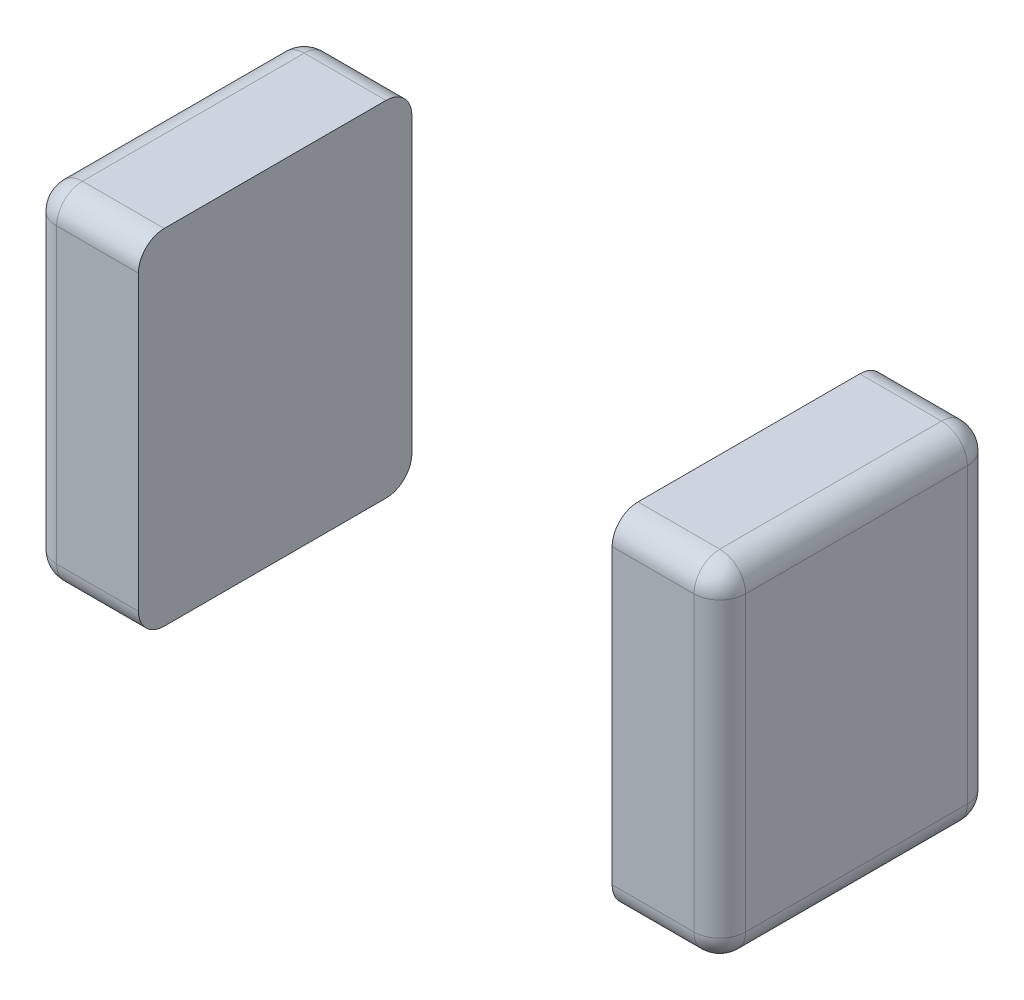
ISO-10303-21;
HEADER;
FILE_DESCRIPTION(('STEP AP214'),'2;1');
FILE_NAME('part.step','',(''),(''),'','','');
FILE_SCHEMA(('AUTOMOTIVE_DESIGN { 1 0 10303 214 1 1 1 1 }'));
ENDSEC;
DATA;
#1=APPLICATION_CONTEXT('core data for automotive mechanical design processes');
#2=APPLICATION_PROTOCOL_DEFINITION('international standard','automotive_design',2000,#1);
#3=PRODUCT_CONTEXT('',#1,'mechanical');
#4=PRODUCT('Part','Part','',(#3));
#5=PRODUCT_RELATED_PRODUCT_CATEGORY('part','',(#4));
#6=PRODUCT_DEFINITION_FORMATION('','',#4);
#7=PRODUCT_DEFINITION_CONTEXT('part definition',#1,'design');
#8=PRODUCT_DEFINITION('design','',#6,#7);
#9=PRODUCT_DEFINITION_SHAPE('','',#8);
#10=(LENGTH_UNIT() NAMED_UNIT(*) SI_UNIT(.MILLI.,.METRE.));
#11=(NAMED_UNIT(*) PLANE_ANGLE_UNIT() SI_UNIT($,.RADIAN.));
#12=(NAMED_UNIT(*) SI_UNIT($,.STERADIAN.) SOLID_ANGLE_UNIT());
#13=UNCERTAINTY_MEASURE_WITH_UNIT(LENGTH_MEASURE(1.E-05),#10,'distance_accuracy_value','');
#14=(GEOMETRIC_REPRESENTATION_CONTEXT(3) GLOBAL_UNCERTAINTY_ASSIGNED_CONTEXT((#13)) GLOBAL_UNIT_ASSIGNED_CONTEXT((#10,
#11,#12)) REPRESENTATION_CONTEXT('',''));
#15=CARTESIAN_POINT('',(0.,0.,0.));
#16=DIRECTION('',(0.,0.,1.));
#17=DIRECTION('',(1.,0.,0.));
#18=AXIS2_PLACEMENT_3D('',#15,#16,#17);
#19=CARTESIAN_POINT('',(-1.35,0.,0.));
#20=DIRECTION('',(0.,0.,1.));
#21=DIRECTION('',(1.,0.,0.));
#22=AXIS2_PLACEMENT_3D('',#19,#20,#21);
#23=PLANE('',#22);
#24=DIRECTION('',(-1.,0.,0.));
#25=VECTOR('',#24,1.);
#26=CARTESIAN_POINT('',(-1.225,0.68,0.));
#27=LINE('',#26,#25);
#28=CARTESIAN_POINT('',(-1.1,0.68,0.));
#29=VERTEX_POINT('',#28);
#30=CARTESIAN_POINT('',(-1.48,0.68,0.));
#31=VERTEX_POINT('',#30);
#32=EDGE_CURVE('P0_E143',#29,#31,#27,.T.);
#33=ORIENTED_EDGE('',*,*,#32,.F.);
#34=DIRECTION('',(0.,1.,0.));
#35=VECTOR('',#34,1.);
#36=CARTESIAN_POINT('',(-1.1,-0.8,0.));
#37=LINE('',#36,#35);
#38=CARTESIAN_POINT('',(-1.1,-0.68,0.));
#39=VERTEX_POINT('',#38);
#40=EDGE_CURVE('P0_E11',#39,#29,#37,.T.);
#41=ORIENTED_EDGE('',*,*,#40,.F.);
#42=DIRECTION('',(1.,0.,0.));
#43=VECTOR('',#42,1.);
#44=CARTESIAN_POINT('',(-1.475,-0.68,0.));
#45=LINE('',#44,#43);
#46=CARTESIAN_POINT('',(-1.48,-0.68,0.));
#47=VERTEX_POINT('',#46);
#48=EDGE_CURVE('P0_E158',#47,#39,#45,.T.);
#49=ORIENTED_EDGE('',*,*,#48,.F.);
#50=DIRECTION('',(0.,-1.,0.));
#51=VECTOR('',#50,1.);
#52=CARTESIAN_POINT('',(-1.48,0.4,0.));
#53=LINE('',#52,#51);
#54=EDGE_CURVE('P0_E184',#31,#47,#53,.T.);
#55=ORIENTED_EDGE('',*,*,#54,.F.);
#56=EDGE_LOOP('',(#33,#41,#49,#55));
#57=FACE_BOUND('',#56,.T.);
#58=ADVANCED_FACE('P0_F17',(#57),#23,.F.);
#59=CARTESIAN_POINT('',(-1.6,-0.8,0.));
#60=DIRECTION('',(0.,-1.,0.));
#61=DIRECTION('',(0.,0.,-1.));
#62=AXIS2_PLACEMENT_3D('',#59,#60,#61);
#63=PLANE('',#62);
#64=DIRECTION('',(-1.,0.,0.));
#65=VECTOR('',#64,1.);
#66=CARTESIAN_POINT('',(-1.475,-0.8,0.12));
#67=LINE('',#66,#65);
#68=CARTESIAN_POINT('',(-1.1,-0.8,0.12));
#69=VERTEX_POINT('',#68);
#70=CARTESIAN_POINT('',(-1.48,-0.8,0.12));
#71=VERTEX_POINT('',#70);
#72=EDGE_CURVE('P0_E165',#69,#71,#67,.T.);
#73=ORIENTED_EDGE('',*,*,#72,.F.);
#74=DIRECTION('',(0.,0.,1.));
#75=VECTOR('',#74,1.);
#76=CARTESIAN_POINT('',(-1.1,-0.8,0.));
#77=LINE('',#76,#75);
#78=CARTESIAN_POINT('',(-1.1,-0.8,1.15));
#79=VERTEX_POINT('',#78);
#80=EDGE_CURVE('P0_E25',#69,#79,#77,.T.);
#81=ORIENTED_EDGE('',*,*,#80,.T.);
#82=DIRECTION('',(1.,0.,0.));
#83=VECTOR('',#82,1.);
#84=CARTESIAN_POINT('',(-1.475,-0.8,1.15));
#85=LINE('',#84,#83);
#86=CARTESIAN_POINT('',(-1.48,-0.8,1.15));
#87=VERTEX_POINT('',#86);
#88=EDGE_CURVE('P0_E209',#87,#79,#85,.T.);
#89=ORIENTED_EDGE('',*,*,#88,.F.);
#90=DIRECTION('',(0.,0.,1.));
#91=VECTOR('',#90,1.);
#92=CARTESIAN_POINT('',(-1.48,-0.8,0.));
#93=LINE('',#92,#91);
#94=EDGE_CURVE('P0_E177',#71,#87,#93,.T.);
#95=ORIENTED_EDGE('',*,*,#94,.F.);
#96=EDGE_LOOP('',(#73,#81,#89,#95));
#97=FACE_BOUND('',#96,.T.);
#98=ADVANCED_FACE('P0_F243',(#97),#63,.T.);
#99=CARTESIAN_POINT('',(-1.1,-0.8,0.));
#100=DIRECTION('',(1.,0.,0.));
#101=DIRECTION('',(0.,1.,0.));
#102=AXIS2_PLACEMENT_3D('',#99,#100,#101);
#103=PLANE('',#102);
#104=CARTESIAN_POINT('',(-1.1,0.68,0.12));
#105=DIRECTION('',(-1.,0.,0.));
#106=DIRECTION('',(0.,0.707106781186548,-0.707106781186548));
#107=AXIS2_PLACEMENT_3D('',#104,#105,#106);
#108=CIRCLE('',#107,0.12);
#109=CARTESIAN_POINT('',(-1.1,0.8,0.12));
#110=VERTEX_POINT('',#109);
#111=EDGE_CURVE('P0_E179',#110,#29,#108,.T.);
#112=ORIENTED_EDGE('',*,*,#111,.F.);
#113=DIRECTION('',(0.,0.,1.));
#114=VECTOR('',#113,1.);
#115=CARTESIAN_POINT('',(-1.1,0.8,0.));
#116=LINE('',#115,#114);
#117=CARTESIAN_POINT('',(-1.1,0.8,1.15));
#118=VERTEX_POINT('',#117);
#119=EDGE_CURVE('P0_E37',#110,#118,#116,.T.);
#120=ORIENTED_EDGE('',*,*,#119,.T.);
#121=CARTESIAN_POINT('',(-1.1,0.68,1.15));
#122=DIRECTION('',(-1.,0.,0.));
#123=DIRECTION('',(0.,0.707106781186548,0.707106781186548));
#124=AXIS2_PLACEMENT_3D('',#121,#122,#123);
#125=CIRCLE('',#124,0.12);
#126=CARTESIAN_POINT('',(-1.1,0.68,1.27));
#127=VERTEX_POINT('',#126);
#128=EDGE_CURVE('P0_E205',#127,#118,#125,.T.);
#129=ORIENTED_EDGE('',*,*,#128,.F.);
#130=DIRECTION('',(0.,1.,0.));
#131=VECTOR('',#130,1.);
#132=CARTESIAN_POINT('',(-1.1,-0.8,1.27));
#133=LINE('',#132,#131);
#134=CARTESIAN_POINT('',(-1.1,-0.68,1.27));
#135=VERTEX_POINT('',#134);
#136=EDGE_CURVE('P0_E47',#135,#127,#133,.T.);
#137=ORIENTED_EDGE('',*,*,#136,.F.);
#138=CARTESIAN_POINT('',(-1.1,-0.68,1.15));
#139=DIRECTION('',(-1.,0.,0.));
#140=DIRECTION('',(0.,-0.707106781186548,0.707106781186548));
#141=AXIS2_PLACEMENT_3D('',#138,#139,#140);
#142=CIRCLE('',#141,0.12);
#143=EDGE_CURVE('P0_E196',#79,#135,#142,.T.);
#144=ORIENTED_EDGE('',*,*,#143,.F.);
#145=ORIENTED_EDGE('',*,*,#80,.F.);
#146=CARTESIAN_POINT('',(-1.1,-0.68,0.12));
#147=DIRECTION('',(-1.,0.,0.));
#148=DIRECTION('',(0.,-0.707106781186548,-0.707106781186548));
#149=AXIS2_PLACEMENT_3D('',#146,#147,#148);
#150=CIRCLE('',#149,0.12);
#151=EDGE_CURVE('P0_E272',#39,#69,#150,.T.);
#152=ORIENTED_EDGE('',*,*,#151,.F.);
#153=ORIENTED_EDGE('',*,*,#40,.T.);
#154=EDGE_LOOP('',(#112,#120,#129,#137,#144,#145,#152,#153));
#155=FACE_BOUND('',#154,.T.);
#156=ADVANCED_FACE('P0_F251',(#155),#103,.T.);
#157=CARTESIAN_POINT('',(-1.6,0.8,0.));
#158=DIRECTION('',(-1.,0.,0.));
#159=DIRECTION('',(0.,1.,0.));
#160=AXIS2_PLACEMENT_3D('',#157,#158,#159);
#161=PLANE('',#160);
#162=DIRECTION('',(0.,1.,0.));
#163=VECTOR('',#162,1.);
#164=CARTESIAN_POINT('',(-1.6,0.4,0.12));
#165=LINE('',#164,#163);
#166=CARTESIAN_POINT('',(-1.6,-0.68,0.12));
#167=VERTEX_POINT('',#166);
#168=CARTESIAN_POINT('',(-1.6,0.68,0.12));
#169=VERTEX_POINT('',#168);
#170=EDGE_CURVE('P0_E142',#167,#169,#165,.T.);
#171=ORIENTED_EDGE('',*,*,#170,.F.);
#172=DIRECTION('',(0.,0.,-1.));
#173=VECTOR('',#172,1.);
#174=CARTESIAN_POINT('',(-1.6,-0.68,0.));
#175=LINE('',#174,#173);
#176=CARTESIAN_POINT('',(-1.6,-0.68,1.15));
#177=VERTEX_POINT('',#176);
#178=EDGE_CURVE('P0_E175',#177,#167,#175,.T.);
#179=ORIENTED_EDGE('',*,*,#178,.F.);
#180=DIRECTION('',(0.,-1.,0.));
#181=VECTOR('',#180,1.);
#182=CARTESIAN_POINT('',(-1.6,0.4,1.15));
#183=LINE('',#182,#181);
#184=CARTESIAN_POINT('',(-1.6,0.68,1.15));
#185=VERTEX_POINT('',#184);
#186=EDGE_CURVE('P0_E227',#185,#177,#183,.T.);
#187=ORIENTED_EDGE('',*,*,#186,.F.);
#188=DIRECTION('',(0.,0.,1.));
#189=VECTOR('',#188,1.);
#190=CARTESIAN_POINT('',(-1.6,0.68,0.));
#191=LINE('',#190,#189);
#192=EDGE_CURVE('P0_E132',#169,#185,#191,.T.);
#193=ORIENTED_EDGE('',*,*,#192,.F.);
#194=EDGE_LOOP('',(#171,#179,#187,#193));
#195=FACE_BOUND('',#194,.T.);
#196=ADVANCED_FACE('P0_F307',(#195),#161,.T.);
#197=CARTESIAN_POINT('',(-1.35,0.,1.27));
#198=DIRECTION('',(0.,0.,1.));
#199=DIRECTION('',(1.,0.,0.));
#200=AXIS2_PLACEMENT_3D('',#197,#198,#199);
#201=PLANE('',#200);
#202=DIRECTION('',(1.,0.,0.));
#203=VECTOR('',#202,1.);
#204=CARTESIAN_POINT('',(-1.225,0.68,1.27));
#205=LINE('',#204,#203);
#206=CARTESIAN_POINT('',(-1.48,0.68,1.27));
#207=VERTEX_POINT('',#206);
#208=EDGE_CURVE('P0_E204',#207,#127,#205,.T.);
#209=ORIENTED_EDGE('',*,*,#208,.F.);
#210=DIRECTION('',(0.,1.,0.));
#211=VECTOR('',#210,1.);
#212=CARTESIAN_POINT('',(-1.48,0.4,1.27));
#213=LINE('',#212,#211);
#214=CARTESIAN_POINT('',(-1.48,-0.68,1.27));
#215=VERTEX_POINT('',#214);
#216=EDGE_CURVE('P0_E223',#215,#207,#213,.T.);
#217=ORIENTED_EDGE('',*,*,#216,.F.);
#218=DIRECTION('',(-1.,0.,0.));
#219=VECTOR('',#218,1.);
#220=CARTESIAN_POINT('',(-1.475,-0.68,1.27));
#221=LINE('',#220,#219);
#222=EDGE_CURVE('P0_E200',#135,#215,#221,.T.);
#223=ORIENTED_EDGE('',*,*,#222,.F.);
#224=ORIENTED_EDGE('',*,*,#136,.T.);
#225=EDGE_LOOP('',(#209,#217,#223,#224));
#226=FACE_BOUND('',#225,.T.);
#227=ADVANCED_FACE('P0_F252',(#226),#201,.T.);
#228=CARTESIAN_POINT('',(-1.1,0.8,0.));
#229=DIRECTION('',(0.,1.,0.));
#230=DIRECTION('',(1.,0.,0.));
#231=AXIS2_PLACEMENT_3D('',#228,#229,#230);
#232=PLANE('',#231);
#233=DIRECTION('',(1.,0.,0.));
#234=VECTOR('',#233,1.);
#235=CARTESIAN_POINT('',(-1.225,0.8,0.12));
#236=LINE('',#235,#234);
#237=CARTESIAN_POINT('',(-1.48,0.8,0.12));
#238=VERTEX_POINT('',#237);
#239=EDGE_CURVE('P0_E136',#238,#110,#236,.T.);
#240=ORIENTED_EDGE('',*,*,#239,.F.);
#241=DIRECTION('',(0.,0.,-1.));
#242=VECTOR('',#241,1.);
#243=CARTESIAN_POINT('',(-1.48,0.8,0.));
#244=LINE('',#243,#242);
#245=CARTESIAN_POINT('',(-1.48,0.8,1.15));
#246=VERTEX_POINT('',#245);
#247=EDGE_CURVE('P0_E121',#246,#238,#244,.T.);
#248=ORIENTED_EDGE('',*,*,#247,.F.);
#249=DIRECTION('',(-1.,0.,0.));
#250=VECTOR('',#249,1.);
#251=CARTESIAN_POINT('',(-1.225,0.8,1.15));
#252=LINE('',#251,#250);
#253=EDGE_CURVE('P0_E201',#118,#246,#252,.T.);
#254=ORIENTED_EDGE('',*,*,#253,.F.);
#255=ORIENTED_EDGE('',*,*,#119,.F.);
#256=EDGE_LOOP('',(#240,#248,#254,#255));
#257=FACE_BOUND('',#256,.T.);
#258=ADVANCED_FACE('P0_F138',(#257),#232,.T.);
#259=CARTESIAN_POINT('',(-1.225,0.68,1.15));
#260=DIRECTION('',(-1.,0.,0.));
#261=DIRECTION('',(0.,0.707106781186548,0.707106781186548));
#262=AXIS2_PLACEMENT_3D('',#259,#260,#261);
#263=CYLINDRICAL_SURFACE('',#262,0.12);
#264=ORIENTED_EDGE('',*,*,#128,.T.);
#265=ORIENTED_EDGE('',*,*,#253,.T.);
#266=CARTESIAN_POINT('',(-1.48,0.68,1.15));
#267=DIRECTION('',(-1.,0.,0.));
#268=DIRECTION('',(0.,1.,0.));
#269=AXIS2_PLACEMENT_3D('',#266,#267,#268);
#270=CIRCLE('',#269,0.12);
#271=EDGE_CURVE('P0_E213',#207,#246,#270,.T.);
#272=ORIENTED_EDGE('',*,*,#271,.F.);
#273=ORIENTED_EDGE('',*,*,#208,.T.);
#274=EDGE_LOOP('',(#264,#265,#272,#273));
#275=FACE_BOUND('',#274,.T.);
#276=ADVANCED_FACE('P0_F312',(#275),#263,.T.);
#277=CARTESIAN_POINT('',(-1.48,0.4,1.15));
#278=DIRECTION('',(0.,-1.,0.));
#279=DIRECTION('',(-0.707106781186548,0.,0.707106781186548));
#280=AXIS2_PLACEMENT_3D('',#277,#278,#279);
#281=CYLINDRICAL_SURFACE('',#280,0.12);
#282=CARTESIAN_POINT('',(-1.48,-0.68,1.15));
#283=DIRECTION('',(0.,-1.,0.));
#284=DIRECTION('',(-1.,0.,0.));
#285=AXIS2_PLACEMENT_3D('',#282,#283,#284);
#286=CIRCLE('',#285,0.12);
#287=EDGE_CURVE('P0_E174',#215,#177,#286,.T.);
#288=ORIENTED_EDGE('',*,*,#287,.F.);
#289=ORIENTED_EDGE('',*,*,#216,.T.);
#290=CARTESIAN_POINT('',(-1.48,0.68,1.15));
#291=DIRECTION('',(0.,1.,0.));
#292=DIRECTION('',(0.,0.,1.));
#293=AXIS2_PLACEMENT_3D('',#290,#291,#292);
#294=CIRCLE('',#293,0.12);
#295=EDGE_CURVE('P0_E133',#185,#207,#294,.T.);
#296=ORIENTED_EDGE('',*,*,#295,.F.);
#297=ORIENTED_EDGE('',*,*,#186,.T.);
#298=EDGE_LOOP('',(#288,#289,#296,#297));
#299=FACE_BOUND('',#298,.T.);
#300=ADVANCED_FACE('P0_F259',(#299),#281,.T.);
#301=CARTESIAN_POINT('',(-1.48,0.68,0.));
#302=DIRECTION('',(0.,0.,1.));
#303=DIRECTION('',(-0.707106781186548,0.707106781186548,0.));
#304=AXIS2_PLACEMENT_3D('',#301,#302,#303);
#305=CYLINDRICAL_SURFACE('',#304,0.12);
#306=CARTESIAN_POINT('',(-1.48,0.68,1.15));
#307=DIRECTION('',(0.,0.,1.));
#308=DIRECTION('',(-1.,0.,0.));
#309=AXIS2_PLACEMENT_3D('',#306,#307,#308);
#310=CIRCLE('',#309,0.12);
#311=EDGE_CURVE('P0_E128',#246,#185,#310,.T.);
#312=ORIENTED_EDGE('',*,*,#311,.F.);
#313=ORIENTED_EDGE('',*,*,#247,.T.);
#314=CARTESIAN_POINT('',(-1.48,0.68,0.12));
#315=DIRECTION('',(0.,0.,-1.));
#316=DIRECTION('',(0.,1.,0.));
#317=AXIS2_PLACEMENT_3D('',#314,#315,#316);
#318=CIRCLE('',#317,0.12);
#319=EDGE_CURVE('P0_E126',#169,#238,#318,.T.);
#320=ORIENTED_EDGE('',*,*,#319,.F.);
#321=ORIENTED_EDGE('',*,*,#192,.T.);
#322=EDGE_LOOP('',(#312,#313,#320,#321));
#323=FACE_BOUND('',#322,.T.);
#324=ADVANCED_FACE('P0_F123',(#323),#305,.T.);
#325=CARTESIAN_POINT('',(-1.48,0.68,1.15));
#326=DIRECTION('',(-0.816496580927726,-0.408248290463863,-0.408248290463863));
#327=DIRECTION('',(-0.577350269189626,0.577350269189626,0.577350269189626));
#328=AXIS2_PLACEMENT_3D('',#325,#326,#327);
#329=SPHERICAL_SURFACE('',#328,0.12);
#330=ORIENTED_EDGE('',*,*,#271,.T.);
#331=ORIENTED_EDGE('',*,*,#311,.T.);
#332=ORIENTED_EDGE('',*,*,#295,.T.);
#333=EDGE_LOOP('',(#330,#331,#332));
#334=FACE_BOUND('',#333,.T.);
#335=ADVANCED_FACE('P0_F310',(#334),#329,.T.);
#336=CARTESIAN_POINT('',(-1.475,-0.68,1.15));
#337=DIRECTION('',(1.,0.,0.));
#338=DIRECTION('',(0.,-0.707106781186548,0.707106781186548));
#339=AXIS2_PLACEMENT_3D('',#336,#337,#338);
#340=CYLINDRICAL_SURFACE('',#339,0.12);
#341=ORIENTED_EDGE('',*,*,#143,.T.);
#342=ORIENTED_EDGE('',*,*,#222,.T.);
#343=CARTESIAN_POINT('',(-1.48,-0.68,1.15));
#344=DIRECTION('',(-1.,0.,0.));
#345=DIRECTION('',(0.,0.,1.));
#346=AXIS2_PLACEMENT_3D('',#343,#344,#345);
#347=CIRCLE('',#346,0.12);
#348=EDGE_CURVE('P0_E173',#87,#215,#347,.T.);
#349=ORIENTED_EDGE('',*,*,#348,.F.);
#350=ORIENTED_EDGE('',*,*,#88,.T.);
#351=EDGE_LOOP('',(#341,#342,#349,#350));
#352=FACE_BOUND('',#351,.T.);
#353=ADVANCED_FACE('P0_F250',(#352),#340,.T.);
#354=CARTESIAN_POINT('',(-1.48,-0.68,0.));
#355=DIRECTION('',(0.,0.,1.));
#356=DIRECTION('',(-0.707106781186548,-0.707106781186548,0.));
#357=AXIS2_PLACEMENT_3D('',#354,#355,#356);
#358=CYLINDRICAL_SURFACE('',#357,0.12);
#359=CARTESIAN_POINT('',(-1.48,-0.68,1.15));
#360=DIRECTION('',(0.,0.,1.));
#361=DIRECTION('',(0.,-1.,0.));
#362=AXIS2_PLACEMENT_3D('',#359,#360,#361);
#363=CIRCLE('',#362,0.12);
#364=EDGE_CURVE('P0_E169',#177,#87,#363,.T.);
#365=ORIENTED_EDGE('',*,*,#364,.F.);
#366=ORIENTED_EDGE('',*,*,#178,.T.);
#367=CARTESIAN_POINT('',(-1.48,-0.68,0.12));
#368=DIRECTION('',(0.,0.,-1.));
#369=DIRECTION('',(-1.,0.,0.));
#370=AXIS2_PLACEMENT_3D('',#367,#368,#369);
#371=CIRCLE('',#370,0.12);
#372=EDGE_CURVE('P0_E268',#71,#167,#371,.T.);
#373=ORIENTED_EDGE('',*,*,#372,.F.);
#374=ORIENTED_EDGE('',*,*,#94,.T.);
#375=EDGE_LOOP('',(#365,#366,#373,#374));
#376=FACE_BOUND('',#375,.T.);
#377=ADVANCED_FACE('P0_F305',(#376),#358,.T.);
#378=CARTESIAN_POINT('',(-1.48,-0.68,1.15));
#379=DIRECTION('',(-0.408248290463863,-0.408248290463863,-0.816496580927726));
#380=DIRECTION('',(-0.577350269189626,-0.577350269189626,0.577350269189626));
#381=AXIS2_PLACEMENT_3D('',#378,#379,#380);
#382=SPHERICAL_SURFACE('',#381,0.12);
#383=ORIENTED_EDGE('',*,*,#287,.T.);
#384=ORIENTED_EDGE('',*,*,#364,.T.);
#385=ORIENTED_EDGE('',*,*,#348,.T.);
#386=EDGE_LOOP('',(#383,#384,#385));
#387=FACE_BOUND('',#386,.T.);
#388=ADVANCED_FACE('P0_F256',(#387),#382,.T.);
#389=CARTESIAN_POINT('',(-1.48,0.4,0.12));
#390=DIRECTION('',(0.,-1.,0.));
#391=DIRECTION('',(-0.707106781186548,0.,-0.707106781186548));
#392=AXIS2_PLACEMENT_3D('',#389,#390,#391);
#393=CYLINDRICAL_SURFACE('',#392,0.12);
#394=CARTESIAN_POINT('',(-1.48,-0.68,0.12));
#395=DIRECTION('',(0.,-1.,0.));
#396=DIRECTION('',(0.,0.,-1.));
#397=AXIS2_PLACEMENT_3D('',#394,#395,#396);
#398=CIRCLE('',#397,0.12);
#399=EDGE_CURVE('P0_E289',#167,#47,#398,.T.);
#400=ORIENTED_EDGE('',*,*,#399,.F.);
#401=ORIENTED_EDGE('',*,*,#170,.T.);
#402=CARTESIAN_POINT('',(-1.48,0.68,0.12));
#403=DIRECTION('',(0.,1.,0.));
#404=DIRECTION('',(-1.,0.,0.));
#405=AXIS2_PLACEMENT_3D('',#402,#403,#404);
#406=CIRCLE('',#405,0.12);
#407=EDGE_CURVE('P0_E154',#31,#169,#406,.T.);
#408=ORIENTED_EDGE('',*,*,#407,.F.);
#409=ORIENTED_EDGE('',*,*,#54,.T.);
#410=EDGE_LOOP('',(#400,#401,#408,#409));
#411=FACE_BOUND('',#410,.T.);
#412=ADVANCED_FACE('P0_F299',(#411),#393,.T.);
#413=CARTESIAN_POINT('',(-1.225,0.68,0.12));
#414=DIRECTION('',(-1.,0.,0.));
#415=DIRECTION('',(0.,0.707106781186548,-0.707106781186548));
#416=AXIS2_PLACEMENT_3D('',#413,#414,#415);
#417=CYLINDRICAL_SURFACE('',#416,0.12);
#418=ORIENTED_EDGE('',*,*,#111,.T.);
#419=ORIENTED_EDGE('',*,*,#32,.T.);
#420=CARTESIAN_POINT('',(-1.48,0.68,0.12));
#421=DIRECTION('',(-1.,0.,0.));
#422=DIRECTION('',(0.,0.,-1.));
#423=AXIS2_PLACEMENT_3D('',#420,#421,#422);
#424=CIRCLE('',#423,0.12);
#425=EDGE_CURVE('P0_E147',#238,#31,#424,.T.);
#426=ORIENTED_EDGE('',*,*,#425,.F.);
#427=ORIENTED_EDGE('',*,*,#239,.T.);
#428=EDGE_LOOP('',(#418,#419,#426,#427));
#429=FACE_BOUND('',#428,.T.);
#430=ADVANCED_FACE('P0_F148',(#429),#417,.T.);
#431=CARTESIAN_POINT('',(-1.48,0.68,0.12));
#432=DIRECTION('',(0.408248290463863,-0.408248290463863,-0.816496580927726));
#433=DIRECTION('',(-0.577350269189626,0.577350269189626,-0.577350269189626));
#434=AXIS2_PLACEMENT_3D('',#431,#432,#433);
#435=SPHERICAL_SURFACE('',#434,0.12);
#436=ORIENTED_EDGE('',*,*,#319,.T.);
#437=ORIENTED_EDGE('',*,*,#425,.T.);
#438=ORIENTED_EDGE('',*,*,#407,.T.);
#439=EDGE_LOOP('',(#436,#437,#438));
#440=FACE_BOUND('',#439,.T.);
#441=ADVANCED_FACE('P0_F156',(#440),#435,.T.);
#442=CARTESIAN_POINT('',(-1.475,-0.68,0.12));
#443=DIRECTION('',(1.,0.,0.));
#444=DIRECTION('',(0.,-0.707106781186548,-0.707106781186548));
#445=AXIS2_PLACEMENT_3D('',#442,#443,#444);
#446=CYLINDRICAL_SURFACE('',#445,0.12);
#447=ORIENTED_EDGE('',*,*,#151,.T.);
#448=ORIENTED_EDGE('',*,*,#72,.T.);
#449=CARTESIAN_POINT('',(-1.48,-0.68,0.12));
#450=DIRECTION('',(-1.,0.,0.));
#451=DIRECTION('',(0.,-1.,0.));
#452=AXIS2_PLACEMENT_3D('',#449,#450,#451);
#453=CIRCLE('',#452,0.12);
#454=EDGE_CURVE('P0_E280',#47,#71,#453,.T.);
#455=ORIENTED_EDGE('',*,*,#454,.F.);
#456=ORIENTED_EDGE('',*,*,#48,.T.);
#457=EDGE_LOOP('',(#447,#448,#455,#456));
#458=FACE_BOUND('',#457,.T.);
#459=ADVANCED_FACE('P0_F303',(#458),#446,.T.);
#460=CARTESIAN_POINT('',(-1.48,-0.68,0.12));
#461=DIRECTION('',(0.408248290463863,0.408248290463863,-0.816496580927726));
#462=DIRECTION('',(-0.577350269189626,-0.577350269189626,-0.577350269189626));
#463=AXIS2_PLACEMENT_3D('',#460,#461,#462);
#464=SPHERICAL_SURFACE('',#463,0.12);
#465=ORIENTED_EDGE('',*,*,#399,.T.);
#466=ORIENTED_EDGE('',*,*,#454,.T.);
#467=ORIENTED_EDGE('',*,*,#372,.T.);
#468=EDGE_LOOP('',(#465,#466,#467));
#469=FACE_BOUND('',#468,.T.);
#470=ADVANCED_FACE('P0_F297',(#469),#464,.T.);
#471=CLOSED_SHELL('',(#58,#98,#156,#196,#227,#258,#276,#300,#324,#335,#353,#377,#388,#412,#430,
#441,#459,#470));
#472=MANIFOLD_SOLID_BREP('P0_B1',#471);
#473=CARTESIAN_POINT('',(1.35,0.,1.27));
#474=DIRECTION('',(0.,0.,1.));
#475=DIRECTION('',(1.,0.,0.));
#476=AXIS2_PLACEMENT_3D('',#473,#474,#475);
#477=PLANE('',#476);
#478=DIRECTION('',(1.,0.,0.));
#479=VECTOR('',#478,1.);
#480=CARTESIAN_POINT('',(1.475,0.68,1.27));
#481=LINE('',#480,#479);
#482=CARTESIAN_POINT('',(1.1,0.68,1.27));
#483=VERTEX_POINT('',#482);
#484=CARTESIAN_POINT('',(1.48,0.68,1.27));
#485=VERTEX_POINT('',#484);
#486=EDGE_CURVE('P1_E184',#483,#485,#481,.T.);
#487=ORIENTED_EDGE('',*,*,#486,.F.);
#488=DIRECTION('',(0.,-1.,0.));
#489=VECTOR('',#488,1.);
#490=CARTESIAN_POINT('',(1.1,0.8,1.27));
#491=LINE('',#490,#489);
#492=CARTESIAN_POINT('',(1.1,-0.68,1.27));
#493=VERTEX_POINT('',#492);
#494=EDGE_CURVE('P1_E25',#483,#493,#491,.T.);
#495=ORIENTED_EDGE('',*,*,#494,.T.);
#496=DIRECTION('',(-1.,0.,0.));
#497=VECTOR('',#496,1.);
#498=CARTESIAN_POINT('',(1.225,-0.68,1.27));
#499=LINE('',#498,#497);
#500=CARTESIAN_POINT('',(1.48,-0.68,1.27));
#501=VERTEX_POINT('',#500);
#502=EDGE_CURVE('P1_E201',#501,#493,#499,.T.);
#503=ORIENTED_EDGE('',*,*,#502,.F.);
#504=DIRECTION('',(0.,-1.,0.));
#505=VECTOR('',#504,1.);
#506=CARTESIAN_POINT('',(1.48,-0.4,1.27));
#507=LINE('',#506,#505);
#508=EDGE_CURVE('P1_E190',#485,#501,#507,.T.);
#509=ORIENTED_EDGE('',*,*,#508,.F.);
#510=EDGE_LOOP('',(#487,#495,#503,#509));
#511=FACE_BOUND('',#510,.T.);
#512=ADVANCED_FACE('P1_F17',(#511),#477,.T.);
#513=CARTESIAN_POINT('',(1.6,0.8,0.));
#514=DIRECTION('',(0.,1.,0.));
#515=DIRECTION('',(1.,0.,0.));
#516=AXIS2_PLACEMENT_3D('',#513,#514,#515);
#517=PLANE('',#516);
#518=DIRECTION('',(1.,0.,0.));
#519=VECTOR('',#518,1.);
#520=CARTESIAN_POINT('',(1.475,0.8,0.12));
#521=LINE('',#520,#519);
#522=CARTESIAN_POINT('',(1.1,0.8,0.12));
#523=VERTEX_POINT('',#522);
#524=CARTESIAN_POINT('',(1.48,0.8,0.12));
#525=VERTEX_POINT('',#524);
#526=EDGE_CURVE('P1_E122',#523,#525,#521,.T.);
#527=ORIENTED_EDGE('',*,*,#526,.F.);
#528=DIRECTION('',(0.,0.,1.));
#529=VECTOR('',#528,1.);
#530=CARTESIAN_POINT('',(1.1,0.8,0.));
#531=LINE('',#530,#529);
#532=CARTESIAN_POINT('',(1.1,0.8,1.15));
#533=VERTEX_POINT('',#532);
#534=EDGE_CURVE('P1_E11',#523,#533,#531,.T.);
#535=ORIENTED_EDGE('',*,*,#534,.T.);
#536=DIRECTION('',(-1.,0.,0.));
#537=VECTOR('',#536,1.);
#538=CARTESIAN_POINT('',(1.475,0.8,1.15));
#539=LINE('',#538,#537);
#540=CARTESIAN_POINT('',(1.48,0.8,1.15));
#541=VERTEX_POINT('',#540);
#542=EDGE_CURVE('P1_E125',#541,#533,#539,.T.);
#543=ORIENTED_EDGE('',*,*,#542,.F.);
#544=DIRECTION('',(0.,0.,1.));
#545=VECTOR('',#544,1.);
#546=CARTESIAN_POINT('',(1.48,0.8,0.));
#547=LINE('',#546,#545);
#548=EDGE_CURVE('P1_E119',#525,#541,#547,.T.);
#549=ORIENTED_EDGE('',*,*,#548,.F.);
#550=EDGE_LOOP('',(#527,#535,#543,#549));
#551=FACE_BOUND('',#550,.T.);
#552=ADVANCED_FACE('P1_F121',(#551),#517,.T.);
#553=CARTESIAN_POINT('',(1.6,-0.8,0.));
#554=DIRECTION('',(1.,0.,0.));
#555=DIRECTION('',(0.,1.,0.));
#556=AXIS2_PLACEMENT_3D('',#553,#554,#555);
#557=PLANE('',#556);
#558=DIRECTION('',(0.,-1.,0.));
#559=VECTOR('',#558,1.);
#560=CARTESIAN_POINT('',(1.6,-0.4,0.12));
#561=LINE('',#560,#559);
#562=CARTESIAN_POINT('',(1.6,0.68,0.12));
#563=VERTEX_POINT('',#562);
#564=CARTESIAN_POINT('',(1.6,-0.68,0.12));
#565=VERTEX_POINT('',#564);
#566=EDGE_CURVE('P1_E153',#563,#565,#561,.T.);
#567=ORIENTED_EDGE('',*,*,#566,.F.);
#568=DIRECTION('',(0.,0.,-1.));
#569=VECTOR('',#568,1.);
#570=CARTESIAN_POINT('',(1.6,0.68,0.));
#571=LINE('',#570,#569);
#572=CARTESIAN_POINT('',(1.6,0.68,1.15));
#573=VERTEX_POINT('',#572);
#574=EDGE_CURVE('P1_E132',#573,#563,#571,.T.);
#575=ORIENTED_EDGE('',*,*,#574,.F.);
#576=DIRECTION('',(0.,1.,0.));
#577=VECTOR('',#576,1.);
#578=CARTESIAN_POINT('',(1.6,-0.4,1.15));
#579=LINE('',#578,#577);
#580=CARTESIAN_POINT('',(1.6,-0.68,1.15));
#581=VERTEX_POINT('',#580);
#582=EDGE_CURVE('P1_E194',#581,#573,#579,.T.);
#583=ORIENTED_EDGE('',*,*,#582,.F.);
#584=DIRECTION('',(0.,0.,1.));
#585=VECTOR('',#584,1.);
#586=CARTESIAN_POINT('',(1.6,-0.68,0.));
#587=LINE('',#586,#585);
#588=EDGE_CURVE('P1_E206',#565,#581,#587,.T.);
#589=ORIENTED_EDGE('',*,*,#588,.F.);
#590=EDGE_LOOP('',(#567,#575,#583,#589));
#591=FACE_BOUND('',#590,.T.);
#592=ADVANCED_FACE('P1_F381',(#591),#557,.T.);
#593=CARTESIAN_POINT('',(1.1,-0.8,0.));
#594=DIRECTION('',(0.,-1.,0.));
#595=DIRECTION('',(0.,0.,-1.));
#596=AXIS2_PLACEMENT_3D('',#593,#594,#595);
#597=PLANE('',#596);
#598=DIRECTION('',(-1.,0.,0.));
#599=VECTOR('',#598,1.);
#600=CARTESIAN_POINT('',(1.225,-0.8,0.12));
#601=LINE('',#600,#599);
#602=CARTESIAN_POINT('',(1.48,-0.8,0.12));
#603=VERTEX_POINT('',#602);
#604=CARTESIAN_POINT('',(1.1,-0.8,0.12));
#605=VERTEX_POINT('',#604);
#606=EDGE_CURVE('P1_E216',#603,#605,#601,.T.);
#607=ORIENTED_EDGE('',*,*,#606,.F.);
#608=DIRECTION('',(0.,0.,-1.));
#609=VECTOR('',#608,1.);
#610=CARTESIAN_POINT('',(1.48,-0.8,0.));
#611=LINE('',#610,#609);
#612=CARTESIAN_POINT('',(1.48,-0.8,1.15));
#613=VERTEX_POINT('',#612);
#614=EDGE_CURVE('P1_E197',#613,#603,#611,.T.);
#615=ORIENTED_EDGE('',*,*,#614,.F.);
#616=DIRECTION('',(1.,0.,0.));
#617=VECTOR('',#616,1.);
#618=CARTESIAN_POINT('',(1.225,-0.8,1.15));
#619=LINE('',#618,#617);
#620=CARTESIAN_POINT('',(1.1,-0.8,1.15));
#621=VERTEX_POINT('',#620);
#622=EDGE_CURVE('P1_E198',#621,#613,#619,.T.);
#623=ORIENTED_EDGE('',*,*,#622,.F.);
#624=DIRECTION('',(0.,0.,1.));
#625=VECTOR('',#624,1.);
#626=CARTESIAN_POINT('',(1.1,-0.8,0.));
#627=LINE('',#626,#625);
#628=EDGE_CURVE('P1_E37',#605,#621,#627,.T.);
#629=ORIENTED_EDGE('',*,*,#628,.F.);
#630=EDGE_LOOP('',(#607,#615,#623,#629));
#631=FACE_BOUND('',#630,.T.);
#632=ADVANCED_FACE('P1_F409',(#631),#597,.T.);
#633=CARTESIAN_POINT('',(1.1,0.8,0.));
#634=DIRECTION('',(-1.,0.,0.));
#635=DIRECTION('',(0.,0.,1.));
#636=AXIS2_PLACEMENT_3D('',#633,#634,#635);
#637=PLANE('',#636);
#638=CARTESIAN_POINT('',(1.1,0.68,0.12));
#639=DIRECTION('',(1.,0.,0.));
#640=DIRECTION('',(0.,0.707106781186548,-0.707106781186548));
#641=AXIS2_PLACEMENT_3D('',#638,#639,#640);
#642=CIRCLE('',#641,0.12);
#643=CARTESIAN_POINT('',(1.1,0.68,0.));
#644=VERTEX_POINT('',#643);
#645=EDGE_CURVE('P1_E142',#644,#523,#642,.T.);
#646=ORIENTED_EDGE('',*,*,#645,.F.);
#647=DIRECTION('',(0.,-1.,0.));
#648=VECTOR('',#647,1.);
#649=CARTESIAN_POINT('',(1.1,0.8,0.));
#650=LINE('',#649,#648);
#651=CARTESIAN_POINT('',(1.1,-0.68,0.));
#652=VERTEX_POINT('',#651);
#653=EDGE_CURVE('P1_E225',#644,#652,#650,.T.);
#654=ORIENTED_EDGE('',*,*,#653,.T.);
#655=CARTESIAN_POINT('',(1.1,-0.68,0.12));
#656=DIRECTION('',(1.,0.,0.));
#657=DIRECTION('',(0.,-0.707106781186548,-0.707106781186548));
#658=AXIS2_PLACEMENT_3D('',#655,#656,#657);
#659=CIRCLE('',#658,0.12);
#660=EDGE_CURVE('P1_E209',#605,#652,#659,.T.);
#661=ORIENTED_EDGE('',*,*,#660,.F.);
#662=ORIENTED_EDGE('',*,*,#628,.T.);
#663=CARTESIAN_POINT('',(1.1,-0.68,1.15));
#664=DIRECTION('',(1.,0.,0.));
#665=DIRECTION('',(0.,-0.707106781186548,0.707106781186548));
#666=AXIS2_PLACEMENT_3D('',#663,#664,#665);
#667=CIRCLE('',#666,0.12);
#668=EDGE_CURVE('P1_E202',#493,#621,#667,.T.);
#669=ORIENTED_EDGE('',*,*,#668,.F.);
#670=ORIENTED_EDGE('',*,*,#494,.F.);
#671=CARTESIAN_POINT('',(1.1,0.68,1.15));
#672=DIRECTION('',(1.,0.,0.));
#673=DIRECTION('',(0.,0.707106781186548,0.707106781186548));
#674=AXIS2_PLACEMENT_3D('',#671,#672,#673);
#675=CIRCLE('',#674,0.12);
#676=EDGE_CURVE('P1_E131',#533,#483,#675,.T.);
#677=ORIENTED_EDGE('',*,*,#676,.F.);
#678=ORIENTED_EDGE('',*,*,#534,.F.);
#679=EDGE_LOOP('',(#646,#654,#661,#662,#669,#670,#677,#678));
#680=FACE_BOUND('',#679,.T.);
#681=ADVANCED_FACE('P1_F390',(#680),#637,.T.);
#682=CARTESIAN_POINT('',(1.35,0.,0.));
#683=DIRECTION('',(0.,0.,1.));
#684=DIRECTION('',(1.,0.,0.));
#685=AXIS2_PLACEMENT_3D('',#682,#683,#684);
#686=PLANE('',#685);
#687=DIRECTION('',(-1.,0.,0.));
#688=VECTOR('',#687,1.);
#689=CARTESIAN_POINT('',(1.475,0.68,0.));
#690=LINE('',#689,#688);
#691=CARTESIAN_POINT('',(1.48,0.68,0.));
#692=VERTEX_POINT('',#691);
#693=EDGE_CURVE('P1_E144',#692,#644,#690,.T.);
#694=ORIENTED_EDGE('',*,*,#693,.F.);
#695=DIRECTION('',(0.,1.,0.));
#696=VECTOR('',#695,1.);
#697=CARTESIAN_POINT('',(1.48,-0.4,0.));
#698=LINE('',#697,#696);
#699=CARTESIAN_POINT('',(1.48,-0.68,0.));
#700=VERTEX_POINT('',#699);
#701=EDGE_CURVE('P1_E175',#700,#692,#698,.T.);
#702=ORIENTED_EDGE('',*,*,#701,.F.);
#703=DIRECTION('',(1.,0.,0.));
#704=VECTOR('',#703,1.);
#705=CARTESIAN_POINT('',(1.225,-0.68,0.));
#706=LINE('',#705,#704);
#707=EDGE_CURVE('P1_E213',#652,#700,#706,.T.);
#708=ORIENTED_EDGE('',*,*,#707,.F.);
#709=ORIENTED_EDGE('',*,*,#653,.F.);
#710=EDGE_LOOP('',(#694,#702,#708,#709));
#711=FACE_BOUND('',#710,.T.);
#712=ADVANCED_FACE('P1_F389',(#711),#686,.F.);
#713=CARTESIAN_POINT('',(1.225,-0.68,1.15));
#714=DIRECTION('',(1.,0.,0.));
#715=DIRECTION('',(0.,-0.707106781186548,0.707106781186548));
#716=AXIS2_PLACEMENT_3D('',#713,#714,#715);
#717=CYLINDRICAL_SURFACE('',#716,0.12);
#718=ORIENTED_EDGE('',*,*,#668,.T.);
#719=ORIENTED_EDGE('',*,*,#622,.T.);
#720=CARTESIAN_POINT('',(1.48,-0.68,1.15));
#721=DIRECTION('',(1.,0.,0.));
#722=DIRECTION('',(0.,-1.,0.));
#723=AXIS2_PLACEMENT_3D('',#720,#721,#722);
#724=CIRCLE('',#723,0.12);
#725=EDGE_CURVE('P1_E361',#501,#613,#724,.T.);
#726=ORIENTED_EDGE('',*,*,#725,.F.);
#727=ORIENTED_EDGE('',*,*,#502,.T.);
#728=EDGE_LOOP('',(#718,#719,#726,#727));
#729=FACE_BOUND('',#728,.T.);
#730=ADVANCED_FACE('P1_F396',(#729),#717,.T.);
#731=CARTESIAN_POINT('',(1.225,-0.68,0.12));
#732=DIRECTION('',(1.,0.,0.));
#733=DIRECTION('',(0.,-0.707106781186548,-0.707106781186548));
#734=AXIS2_PLACEMENT_3D('',#731,#732,#733);
#735=CYLINDRICAL_SURFACE('',#734,0.12);
#736=ORIENTED_EDGE('',*,*,#660,.T.);
#737=ORIENTED_EDGE('',*,*,#707,.T.);
#738=CARTESIAN_POINT('',(1.48,-0.68,0.12));
#739=DIRECTION('',(1.,0.,0.));
#740=DIRECTION('',(0.,0.,-1.));
#741=AXIS2_PLACEMENT_3D('',#738,#739,#740);
#742=CIRCLE('',#741,0.12);
#743=EDGE_CURVE('P1_E342',#603,#700,#742,.T.);
#744=ORIENTED_EDGE('',*,*,#743,.F.);
#745=ORIENTED_EDGE('',*,*,#606,.T.);
#746=EDGE_LOOP('',(#736,#737,#744,#745));
#747=FACE_BOUND('',#746,.T.);
#748=ADVANCED_FACE('P1_F407',(#747),#735,.T.);
#749=CARTESIAN_POINT('',(1.48,-0.68,0.));
#750=DIRECTION('',(0.,0.,1.));
#751=DIRECTION('',(0.707106781186548,-0.707106781186548,0.));
#752=AXIS2_PLACEMENT_3D('',#749,#750,#751);
#753=CYLINDRICAL_SURFACE('',#752,0.12);
#754=CARTESIAN_POINT('',(1.48,-0.68,1.15));
#755=DIRECTION('',(0.,0.,1.));
#756=DIRECTION('',(1.,0.,0.));
#757=AXIS2_PLACEMENT_3D('',#754,#755,#756);
#758=CIRCLE('',#757,0.12);
#759=EDGE_CURVE('P1_E354',#613,#581,#758,.T.);
#760=ORIENTED_EDGE('',*,*,#759,.F.);
#761=ORIENTED_EDGE('',*,*,#614,.T.);
#762=CARTESIAN_POINT('',(1.48,-0.68,0.12));
#763=DIRECTION('',(0.,0.,-1.));
#764=DIRECTION('',(0.,-1.,0.));
#765=AXIS2_PLACEMENT_3D('',#762,#763,#764);
#766=CIRCLE('',#765,0.12);
#767=EDGE_CURVE('P1_E325',#565,#603,#766,.T.);
#768=ORIENTED_EDGE('',*,*,#767,.F.);
#769=ORIENTED_EDGE('',*,*,#588,.T.);
#770=EDGE_LOOP('',(#760,#761,#768,#769));
#771=FACE_BOUND('',#770,.T.);
#772=ADVANCED_FACE('P1_F402',(#771),#753,.T.);
#773=CARTESIAN_POINT('',(1.48,-0.4,1.15));
#774=DIRECTION('',(0.,1.,0.));
#775=DIRECTION('',(0.707106781186548,0.,0.707106781186548));
#776=AXIS2_PLACEMENT_3D('',#773,#774,#775);
#777=CYLINDRICAL_SURFACE('',#776,0.12);
#778=CARTESIAN_POINT('',(1.48,0.68,1.15));
#779=DIRECTION('',(0.,1.,0.));
#780=DIRECTION('',(1.,0.,0.));
#781=AXIS2_PLACEMENT_3D('',#778,#779,#780);
#782=CIRCLE('',#781,0.12);
#783=EDGE_CURVE('P1_E171',#485,#573,#782,.T.);
#784=ORIENTED_EDGE('',*,*,#783,.F.);
#785=ORIENTED_EDGE('',*,*,#508,.T.);
#786=CARTESIAN_POINT('',(1.48,-0.68,1.15));
#787=DIRECTION('',(0.,-1.,0.));
#788=DIRECTION('',(0.,0.,1.));
#789=AXIS2_PLACEMENT_3D('',#786,#787,#788);
#790=CIRCLE('',#789,0.12);
#791=EDGE_CURVE('P1_E348',#581,#501,#790,.T.);
#792=ORIENTED_EDGE('',*,*,#791,.F.);
#793=ORIENTED_EDGE('',*,*,#582,.T.);
#794=EDGE_LOOP('',(#784,#785,#792,#793));
#795=FACE_BOUND('',#794,.T.);
#796=ADVANCED_FACE('P1_F377',(#795),#777,.T.);
#797=CARTESIAN_POINT('',(1.475,0.68,1.15));
#798=DIRECTION('',(-1.,0.,0.));
#799=DIRECTION('',(0.,0.707106781186548,0.707106781186548));
#800=AXIS2_PLACEMENT_3D('',#797,#798,#799);
#801=CYLINDRICAL_SURFACE('',#800,0.12);
#802=ORIENTED_EDGE('',*,*,#676,.T.);
#803=ORIENTED_EDGE('',*,*,#486,.T.);
#804=CARTESIAN_POINT('',(1.48,0.68,1.15));
#805=DIRECTION('',(1.,0.,0.));
#806=DIRECTION('',(0.,0.,1.));
#807=AXIS2_PLACEMENT_3D('',#804,#805,#806);
#808=CIRCLE('',#807,0.12);
#809=EDGE_CURVE('P1_E159',#541,#485,#808,.T.);
#810=ORIENTED_EDGE('',*,*,#809,.F.);
#811=ORIENTED_EDGE('',*,*,#542,.T.);
#812=EDGE_LOOP('',(#802,#803,#810,#811));
#813=FACE_BOUND('',#812,.T.);
#814=ADVANCED_FACE('P1_F393',(#813),#801,.T.);
#815=CARTESIAN_POINT('',(1.48,0.68,0.));
#816=DIRECTION('',(0.,0.,1.));
#817=DIRECTION('',(0.707106781186548,0.707106781186548,0.));
#818=AXIS2_PLACEMENT_3D('',#815,#816,#817);
#819=CYLINDRICAL_SURFACE('',#818,0.12);
#820=CARTESIAN_POINT('',(1.48,0.68,1.15));
#821=DIRECTION('',(0.,0.,1.));
#822=DIRECTION('',(0.,1.,0.));
#823=AXIS2_PLACEMENT_3D('',#820,#821,#822);
#824=CIRCLE('',#823,0.12);
#825=EDGE_CURVE('P1_E168',#573,#541,#824,.T.);
#826=ORIENTED_EDGE('',*,*,#825,.F.);
#827=ORIENTED_EDGE('',*,*,#574,.T.);
#828=CARTESIAN_POINT('',(1.48,0.68,0.12));
#829=DIRECTION('',(0.,0.,-1.));
#830=DIRECTION('',(1.,0.,0.));
#831=AXIS2_PLACEMENT_3D('',#828,#829,#830);
#832=CIRCLE('',#831,0.12);
#833=EDGE_CURVE('P1_E149',#525,#563,#832,.T.);
#834=ORIENTED_EDGE('',*,*,#833,.F.);
#835=ORIENTED_EDGE('',*,*,#548,.T.);
#836=EDGE_LOOP('',(#826,#827,#834,#835));
#837=FACE_BOUND('',#836,.T.);
#838=ADVANCED_FACE('P1_F155',(#837),#819,.T.);
#839=CARTESIAN_POINT('',(1.475,0.68,0.12));
#840=DIRECTION('',(-1.,0.,0.));
#841=DIRECTION('',(0.,0.707106781186548,-0.707106781186548));
#842=AXIS2_PLACEMENT_3D('',#839,#840,#841);
#843=CYLINDRICAL_SURFACE('',#842,0.12);
#844=ORIENTED_EDGE('',*,*,#645,.T.);
#845=ORIENTED_EDGE('',*,*,#526,.T.);
#846=CARTESIAN_POINT('',(1.48,0.68,0.12));
#847=DIRECTION('',(1.,0.,0.));
#848=DIRECTION('',(0.,1.,0.));
#849=AXIS2_PLACEMENT_3D('',#846,#847,#848);
#850=CIRCLE('',#849,0.12);
#851=EDGE_CURVE('P1_E139',#692,#525,#850,.T.);
#852=ORIENTED_EDGE('',*,*,#851,.F.);
#853=ORIENTED_EDGE('',*,*,#693,.T.);
#854=EDGE_LOOP('',(#844,#845,#852,#853));
#855=FACE_BOUND('',#854,.T.);
#856=ADVANCED_FACE('P1_F137',(#855),#843,.T.);
#857=CARTESIAN_POINT('',(1.48,-0.4,0.12));
#858=DIRECTION('',(0.,1.,0.));
#859=DIRECTION('',(0.707106781186548,0.,-0.707106781186548));
#860=AXIS2_PLACEMENT_3D('',#857,#858,#859);
#861=CYLINDRICAL_SURFACE('',#860,0.12);
#862=CARTESIAN_POINT('',(1.48,0.68,0.12));
#863=DIRECTION('',(0.,1.,0.));
#864=DIRECTION('',(0.,0.,-1.));
#865=AXIS2_PLACEMENT_3D('',#862,#863,#864);
#866=CIRCLE('',#865,0.12);
#867=EDGE_CURVE('P1_E151',#563,#692,#866,.T.);
#868=ORIENTED_EDGE('',*,*,#867,.F.);
#869=ORIENTED_EDGE('',*,*,#566,.T.);
#870=CARTESIAN_POINT('',(1.48,-0.68,0.12));
#871=DIRECTION('',(0.,-1.,0.));
#872=DIRECTION('',(1.,0.,0.));
#873=AXIS2_PLACEMENT_3D('',#870,#871,#872);
#874=CIRCLE('',#873,0.12);
#875=EDGE_CURVE('P1_E335',#700,#565,#874,.T.);
#876=ORIENTED_EDGE('',*,*,#875,.F.);
#877=ORIENTED_EDGE('',*,*,#701,.T.);
#878=EDGE_LOOP('',(#868,#869,#876,#877));
#879=FACE_BOUND('',#878,.T.);
#880=ADVANCED_FACE('P1_F385',(#879),#861,.T.);
#881=CARTESIAN_POINT('',(1.48,0.68,0.12));
#882=DIRECTION('',(-0.816496580927726,0.408248290463863,-0.408248290463863));
#883=DIRECTION('',(0.577350269189626,0.577350269189626,-0.577350269189626));
#884=AXIS2_PLACEMENT_3D('',#881,#882,#883);
#885=SPHERICAL_SURFACE('',#884,0.12);
#886=ORIENTED_EDGE('',*,*,#833,.T.);
#887=ORIENTED_EDGE('',*,*,#867,.T.);
#888=ORIENTED_EDGE('',*,*,#851,.T.);
#889=EDGE_LOOP('',(#886,#887,#888));
#890=FACE_BOUND('',#889,.T.);
#891=ADVANCED_FACE('P1_F148',(#890),#885,.T.);
#892=CARTESIAN_POINT('',(1.48,0.68,1.15));
#893=DIRECTION('',(0.408248290463863,0.408248290463863,-0.816496580927726));
#894=DIRECTION('',(0.577350269189626,0.577350269189626,0.577350269189626));
#895=AXIS2_PLACEMENT_3D('',#892,#893,#894);
#896=SPHERICAL_SURFACE('',#895,0.12);
#897=ORIENTED_EDGE('',*,*,#783,.T.);
#898=ORIENTED_EDGE('',*,*,#825,.T.);
#899=ORIENTED_EDGE('',*,*,#809,.T.);
#900=EDGE_LOOP('',(#897,#898,#899));
#901=FACE_BOUND('',#900,.T.);
#902=ADVANCED_FACE('P1_F374',(#901),#896,.T.);
#903=CARTESIAN_POINT('',(1.48,-0.68,0.12));
#904=DIRECTION('',(-0.408248290463863,0.408248290463863,-0.816496580927726));
#905=DIRECTION('',(0.577350269189626,-0.577350269189626,-0.577350269189626));
#906=AXIS2_PLACEMENT_3D('',#903,#904,#905);
#907=SPHERICAL_SURFACE('',#906,0.12);
#908=ORIENTED_EDGE('',*,*,#743,.T.);
#909=ORIENTED_EDGE('',*,*,#875,.T.);
#910=ORIENTED_EDGE('',*,*,#767,.T.);
#911=EDGE_LOOP('',(#908,#909,#910));
#912=FACE_BOUND('',#911,.T.);
#913=ADVANCED_FACE('P1_F405',(#912),#907,.T.);
#914=CARTESIAN_POINT('',(1.48,-0.68,1.15));
#915=DIRECTION('',(0.408248290463863,-0.408248290463863,-0.816496580927726));
#916=DIRECTION('',(0.577350269189626,-0.577350269189626,0.577350269189626));
#917=AXIS2_PLACEMENT_3D('',#914,#915,#916);
#918=SPHERICAL_SURFACE('',#917,0.12);
#919=ORIENTED_EDGE('',*,*,#725,.T.);
#920=ORIENTED_EDGE('',*,*,#759,.T.);
#921=ORIENTED_EDGE('',*,*,#791,.T.);
#922=EDGE_LOOP('',(#919,#920,#921));
#923=FACE_BOUND('',#922,.T.);
#924=ADVANCED_FACE('P1_F399',(#923),#918,.T.);
#925=CLOSED_SHELL('',(#512,#552,#592,#632,#681,#712,#730,#748,#772,#796,#814,#838,#856,#880,
#891,#902,#913,#924));
#926=MANIFOLD_SOLID_BREP('P1_B1',#925);
#927=ADVANCED_BREP_SHAPE_REPRESENTATION('',(#18,#472,#926),#14);
#928=SHAPE_DEFINITION_REPRESENTATION(#9,#927);
ENDSEC;
END-ISO-10303-21;
